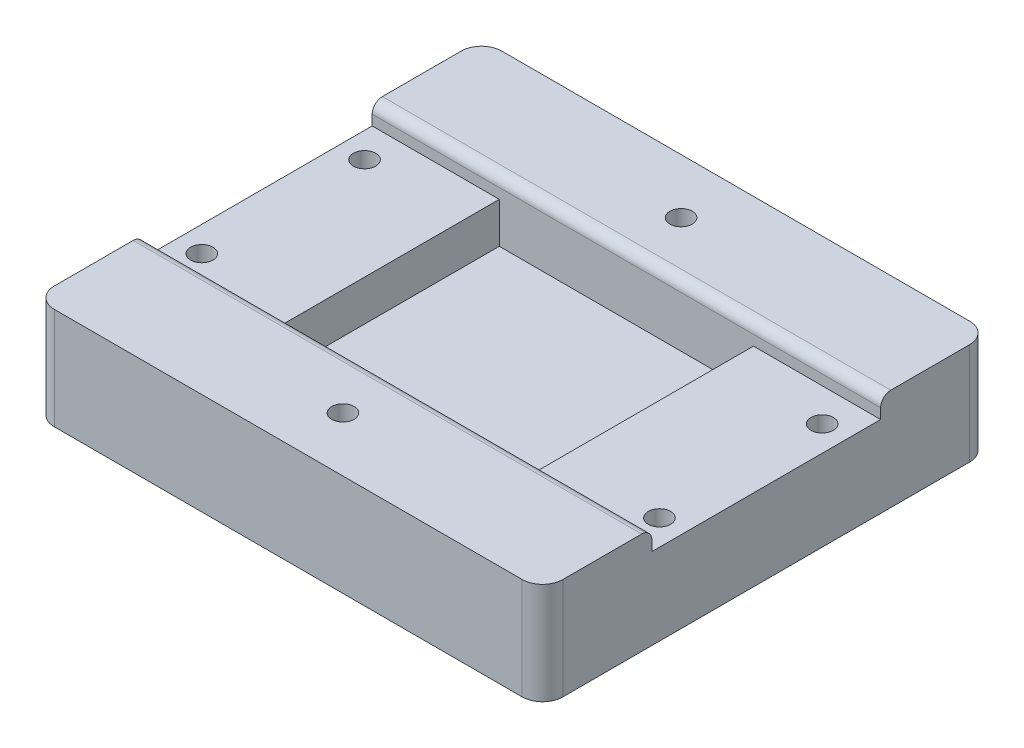
ISO-10303-21;
HEADER;
FILE_DESCRIPTION(('STEP AP214'),'2;1');
FILE_NAME('part.step','',(''),(''),'','','');
FILE_SCHEMA(('AUTOMOTIVE_DESIGN { 1 0 10303 214 1 1 1 1 }'));
ENDSEC;
DATA;
#1=APPLICATION_CONTEXT('core data for automotive mechanical design processes');
#2=APPLICATION_PROTOCOL_DEFINITION('international standard','automotive_design',2000,#1);
#3=PRODUCT_CONTEXT('',#1,'mechanical');
#4=PRODUCT('Part','Part','',(#3));
#5=PRODUCT_RELATED_PRODUCT_CATEGORY('part','',(#4));
#6=PRODUCT_DEFINITION_FORMATION('','',#4);
#7=PRODUCT_DEFINITION_CONTEXT('part definition',#1,'design');
#8=PRODUCT_DEFINITION('design','',#6,#7);
#9=PRODUCT_DEFINITION_SHAPE('','',#8);
#10=(LENGTH_UNIT() NAMED_UNIT(*) SI_UNIT(.MILLI.,.METRE.));
#11=(NAMED_UNIT(*) PLANE_ANGLE_UNIT() SI_UNIT($,.RADIAN.));
#12=(NAMED_UNIT(*) SI_UNIT($,.STERADIAN.) SOLID_ANGLE_UNIT());
#13=UNCERTAINTY_MEASURE_WITH_UNIT(LENGTH_MEASURE(1.E-05),#10,'distance_accuracy_value','');
#14=(GEOMETRIC_REPRESENTATION_CONTEXT(3) GLOBAL_UNCERTAINTY_ASSIGNED_CONTEXT((#13)) GLOBAL_UNIT_ASSIGNED_CONTEXT((#10,
#11,#12)) REPRESENTATION_CONTEXT('',''));
#15=CARTESIAN_POINT('',(0.,0.,0.));
#16=DIRECTION('',(0.,0.,1.));
#17=DIRECTION('',(1.,0.,0.));
#18=AXIS2_PLACEMENT_3D('',#15,#16,#17);
#19=CARTESIAN_POINT('',(0.,8.,0.));
#20=DIRECTION('',(0.,1.,0.));
#21=DIRECTION('',(0.,0.,1.));
#22=AXIS2_PLACEMENT_3D('',#19,#20,#21);
#23=PLANE('',#22);
#24=CARTESIAN_POINT('',(-22.5,8.,-8.));
#25=DIRECTION('',(0.,1.,0.));
#26=DIRECTION('',(0.,0.,1.));
#27=AXIS2_PLACEMENT_3D('',#24,#25,#26);
#28=CIRCLE('',#27,1.1);
#29=CARTESIAN_POINT('',(-22.5,8.,-6.9));
#30=VERTEX_POINT('',#29);
#31=EDGE_CURVE('E477',#30,#30,#28,.T.);
#32=ORIENTED_EDGE('',*,*,#31,.F.);
#33=EDGE_LOOP('',(#32));
#34=FACE_BOUND('',#33,.T.);
#35=CARTESIAN_POINT('',(-22.5,8.,8.));
#36=DIRECTION('',(0.,1.,0.));
#37=DIRECTION('',(0.,0.,1.));
#38=AXIS2_PLACEMENT_3D('',#35,#36,#37);
#39=CIRCLE('',#38,1.1);
#40=CARTESIAN_POINT('',(-22.5,8.,9.1));
#41=VERTEX_POINT('',#40);
#42=EDGE_CURVE('E193',#41,#41,#39,.T.);
#43=ORIENTED_EDGE('',*,*,#42,.F.);
#44=EDGE_LOOP('',(#43));
#45=FACE_BOUND('',#44,.T.);
#46=DIRECTION('',(0.,0.,1.));
#47=VECTOR('',#46,1.);
#48=CARTESIAN_POINT('',(-12.5,8.,11.25));
#49=LINE('',#48,#47);
#50=CARTESIAN_POINT('',(-12.5,8.,-11.25));
#51=VERTEX_POINT('',#50);
#52=CARTESIAN_POINT('',(-12.5,8.,11.25));
#53=VERTEX_POINT('',#52);
#54=EDGE_CURVE('E169',#51,#53,#49,.T.);
#55=ORIENTED_EDGE('',*,*,#54,.F.);
#56=DIRECTION('',(-1.,0.,0.));
#57=VECTOR('',#56,1.);
#58=CARTESIAN_POINT('',(29.,8.,-11.25));
#59=LINE('',#58,#57);
#60=CARTESIAN_POINT('',(-25.,8.,-11.25));
#61=VERTEX_POINT('',#60);
#62=EDGE_CURVE('E208',#51,#61,#59,.T.);
#63=ORIENTED_EDGE('',*,*,#62,.T.);
#64=DIRECTION('',(0.,0.,1.));
#65=VECTOR('',#64,1.);
#66=CARTESIAN_POINT('',(-25.,8.,22.));
#67=LINE('',#66,#65);
#68=CARTESIAN_POINT('',(-25.,8.,11.25));
#69=VERTEX_POINT('',#68);
#70=EDGE_CURVE('E221',#61,#69,#67,.T.);
#71=ORIENTED_EDGE('',*,*,#70,.T.);
#72=DIRECTION('',(1.,0.,0.));
#73=VECTOR('',#72,1.);
#74=CARTESIAN_POINT('',(29.,8.,11.25));
#75=LINE('',#74,#73);
#76=EDGE_CURVE('E206',#69,#53,#75,.T.);
#77=ORIENTED_EDGE('',*,*,#76,.T.);
#78=EDGE_LOOP('',(#55,#63,#71,#77));
#79=FACE_BOUND('',#78,.T.);
#80=ADVANCED_FACE('F37',(#34,#45,#79),#23,.T.);
#81=CARTESIAN_POINT('',(0.,10.,0.));
#82=DIRECTION('',(0.,1.,0.));
#83=DIRECTION('',(0.,0.,1.));
#84=AXIS2_PLACEMENT_3D('',#81,#82,#83);
#85=PLANE('',#84);
#86=CARTESIAN_POINT('',(0.,10.,-16.625));
#87=DIRECTION('',(0.,1.,0.));
#88=DIRECTION('',(0.,0.,1.));
#89=AXIS2_PLACEMENT_3D('',#86,#87,#88);
#90=CIRCLE('',#89,1.1);
#91=CARTESIAN_POINT('',(0.,10.,-15.525));
#92=VERTEX_POINT('',#91);
#93=EDGE_CURVE('E467',#92,#92,#90,.T.);
#94=ORIENTED_EDGE('',*,*,#93,.F.);
#95=EDGE_LOOP('',(#94));
#96=FACE_BOUND('',#95,.T.);
#97=DIRECTION('',(0.,0.,1.));
#98=VECTOR('',#97,1.);
#99=CARTESIAN_POINT('',(-25.,10.,22.));
#100=LINE('',#99,#98);
#101=CARTESIAN_POINT('',(-25.,10.,-20.));
#102=VERTEX_POINT('',#101);
#103=CARTESIAN_POINT('',(-25.,10.,-12.25));
#104=VERTEX_POINT('',#103);
#105=EDGE_CURVE('E225',#102,#104,#100,.T.);
#106=ORIENTED_EDGE('',*,*,#105,.T.);
#107=DIRECTION('',(-1.,0.,0.));
#108=VECTOR('',#107,1.);
#109=CARTESIAN_POINT('',(25.,10.,-12.25));
#110=LINE('',#109,#108);
#111=CARTESIAN_POINT('',(25.,10.,-12.25));
#112=VERTEX_POINT('',#111);
#113=EDGE_CURVE('E11',#104,#112,#110,.F.);
#114=ORIENTED_EDGE('',*,*,#113,.T.);
#115=DIRECTION('',(0.,0.,-1.));
#116=VECTOR('',#115,1.);
#117=CARTESIAN_POINT('',(25.,10.,22.));
#118=LINE('',#117,#116);
#119=CARTESIAN_POINT('',(25.,10.,-20.));
#120=VERTEX_POINT('',#119);
#121=EDGE_CURVE('E231',#112,#120,#118,.T.);
#122=ORIENTED_EDGE('',*,*,#121,.T.);
#123=CARTESIAN_POINT('',(23.,10.,-20.));
#124=DIRECTION('',(0.,1.,0.));
#125=DIRECTION('',(0.,0.,1.));
#126=AXIS2_PLACEMENT_3D('',#123,#124,#125);
#127=CIRCLE('',#126,2.);
#128=CARTESIAN_POINT('',(23.,10.,-22.));
#129=VERTEX_POINT('',#128);
#130=EDGE_CURVE('E271',#120,#129,#127,.T.);
#131=ORIENTED_EDGE('',*,*,#130,.T.);
#132=DIRECTION('',(-1.,0.,0.));
#133=VECTOR('',#132,1.);
#134=CARTESIAN_POINT('',(25.,10.,-22.));
#135=LINE('',#134,#133);
#136=CARTESIAN_POINT('',(-23.,10.,-22.));
#137=VERTEX_POINT('',#136);
#138=EDGE_CURVE('E235',#129,#137,#135,.T.);
#139=ORIENTED_EDGE('',*,*,#138,.T.);
#140=CARTESIAN_POINT('',(-23.,10.,-20.));
#141=DIRECTION('',(0.,1.,0.));
#142=DIRECTION('',(0.,0.,1.));
#143=AXIS2_PLACEMENT_3D('',#140,#141,#142);
#144=CIRCLE('',#143,2.);
#145=EDGE_CURVE('E273',#137,#102,#144,.T.);
#146=ORIENTED_EDGE('',*,*,#145,.T.);
#147=EDGE_LOOP('',(#106,#114,#122,#131,#139,#146));
#148=FACE_BOUND('',#147,.T.);
#149=ADVANCED_FACE('F347',(#96,#148),#85,.T.);
#150=CARTESIAN_POINT('',(-25.,10.,22.));
#151=DIRECTION('',(1.,0.,0.));
#152=DIRECTION('',(0.,0.,-1.));
#153=AXIS2_PLACEMENT_3D('',#150,#151,#152);
#154=PLANE('',#153);
#155=CARTESIAN_POINT('',(-25.,10.,12.25));
#156=VERTEX_POINT('',#155);
#157=CARTESIAN_POINT('',(-25.,10.,20.));
#158=VERTEX_POINT('',#157);
#159=EDGE_CURVE('E228',#156,#158,#100,.T.);
#160=ORIENTED_EDGE('',*,*,#159,.F.);
#161=CARTESIAN_POINT('',(-25.,9.,12.25));
#162=DIRECTION('',(1.,0.,0.));
#163=DIRECTION('',(0.,0.,-1.));
#164=AXIS2_PLACEMENT_3D('',#161,#162,#163);
#165=CIRCLE('',#164,1.);
#166=CARTESIAN_POINT('',(-25.,9.,11.25));
#167=VERTEX_POINT('',#166);
#168=EDGE_CURVE('E300',#156,#167,#165,.F.);
#169=ORIENTED_EDGE('',*,*,#168,.T.);
#170=DIRECTION('',(0.,-1.,0.));
#171=VECTOR('',#170,1.);
#172=CARTESIAN_POINT('',(-25.,10.,11.25));
#173=LINE('',#172,#171);
#174=EDGE_CURVE('E215',#167,#69,#173,.T.);
#175=ORIENTED_EDGE('',*,*,#174,.T.);
#176=ORIENTED_EDGE('',*,*,#70,.F.);
#177=DIRECTION('',(0.,1.,0.));
#178=VECTOR('',#177,1.);
#179=CARTESIAN_POINT('',(-25.,10.,-11.25));
#180=LINE('',#179,#178);
#181=CARTESIAN_POINT('',(-25.,9.,-11.25));
#182=VERTEX_POINT('',#181);
#183=EDGE_CURVE('E219',#61,#182,#180,.T.);
#184=ORIENTED_EDGE('',*,*,#183,.T.);
#185=CARTESIAN_POINT('',(-25.,9.,-12.25));
#186=DIRECTION('',(1.,0.,0.));
#187=DIRECTION('',(0.,0.,-1.));
#188=AXIS2_PLACEMENT_3D('',#185,#186,#187);
#189=CIRCLE('',#188,1.);
#190=EDGE_CURVE('E52',#182,#104,#189,.F.);
#191=ORIENTED_EDGE('',*,*,#190,.T.);
#192=ORIENTED_EDGE('',*,*,#105,.F.);
#193=DIRECTION('',(0.,-1.,0.));
#194=VECTOR('',#193,1.);
#195=CARTESIAN_POINT('',(-25.,10.,-20.));
#196=LINE('',#195,#194);
#197=CARTESIAN_POINT('',(-25.,0.,-20.));
#198=VERTEX_POINT('',#197);
#199=EDGE_CURVE('E255',#102,#198,#196,.T.);
#200=ORIENTED_EDGE('',*,*,#199,.T.);
#201=DIRECTION('',(0.,0.,1.));
#202=VECTOR('',#201,1.);
#203=CARTESIAN_POINT('',(-25.,0.,22.));
#204=LINE('',#203,#202);
#205=CARTESIAN_POINT('',(-25.,0.,20.));
#206=VERTEX_POINT('',#205);
#207=EDGE_CURVE('E224',#198,#206,#204,.T.);
#208=ORIENTED_EDGE('',*,*,#207,.T.);
#209=DIRECTION('',(0.,-1.,0.));
#210=VECTOR('',#209,1.);
#211=CARTESIAN_POINT('',(-25.,10.,20.));
#212=LINE('',#211,#210);
#213=EDGE_CURVE('E252',#206,#158,#212,.F.);
#214=ORIENTED_EDGE('',*,*,#213,.T.);
#215=EDGE_LOOP('',(#160,#169,#175,#176,#184,#191,#192,#200,#208,#214));
#216=FACE_BOUND('',#215,.T.);
#217=ADVANCED_FACE('F310',(#216),#154,.F.);
#218=CARTESIAN_POINT('',(25.,10.,22.));
#219=DIRECTION('',(0.,0.,-1.));
#220=DIRECTION('',(-1.,0.,0.));
#221=AXIS2_PLACEMENT_3D('',#218,#219,#220);
#222=PLANE('',#221);
#223=DIRECTION('',(1.,0.,0.));
#224=VECTOR('',#223,1.);
#225=CARTESIAN_POINT('',(25.,10.,22.));
#226=LINE('',#225,#224);
#227=CARTESIAN_POINT('',(-23.,10.,22.));
#228=VERTEX_POINT('',#227);
#229=CARTESIAN_POINT('',(23.,10.,22.));
#230=VERTEX_POINT('',#229);
#231=EDGE_CURVE('E227',#228,#230,#226,.T.);
#232=ORIENTED_EDGE('',*,*,#231,.F.);
#233=DIRECTION('',(0.,-1.,0.));
#234=VECTOR('',#233,1.);
#235=CARTESIAN_POINT('',(-23.,10.,22.));
#236=LINE('',#235,#234);
#237=CARTESIAN_POINT('',(-23.,0.,22.));
#238=VERTEX_POINT('',#237);
#239=EDGE_CURVE('E277',#228,#238,#236,.T.);
#240=ORIENTED_EDGE('',*,*,#239,.T.);
#241=DIRECTION('',(1.,0.,0.));
#242=VECTOR('',#241,1.);
#243=CARTESIAN_POINT('',(25.,0.,22.));
#244=LINE('',#243,#242);
#245=CARTESIAN_POINT('',(23.,0.,22.));
#246=VERTEX_POINT('',#245);
#247=EDGE_CURVE('E241',#238,#246,#244,.T.);
#248=ORIENTED_EDGE('',*,*,#247,.T.);
#249=DIRECTION('',(0.,-1.,0.));
#250=VECTOR('',#249,1.);
#251=CARTESIAN_POINT('',(23.,10.,22.));
#252=LINE('',#251,#250);
#253=EDGE_CURVE('E275',#246,#230,#252,.F.);
#254=ORIENTED_EDGE('',*,*,#253,.T.);
#255=EDGE_LOOP('',(#232,#240,#248,#254));
#256=FACE_BOUND('',#255,.T.);
#257=ADVANCED_FACE('F357',(#256),#222,.F.);
#258=CARTESIAN_POINT('',(25.,10.,22.));
#259=DIRECTION('',(-1.,0.,0.));
#260=DIRECTION('',(0.,0.,1.));
#261=AXIS2_PLACEMENT_3D('',#258,#259,#260);
#262=PLANE('',#261);
#263=DIRECTION('',(0.,1.,0.));
#264=VECTOR('',#263,1.);
#265=CARTESIAN_POINT('',(25.,10.,11.25));
#266=LINE('',#265,#264);
#267=CARTESIAN_POINT('',(25.,8.,11.25));
#268=VERTEX_POINT('',#267);
#269=CARTESIAN_POINT('',(25.,9.,11.25));
#270=VERTEX_POINT('',#269);
#271=EDGE_CURVE('E212',#268,#270,#266,.T.);
#272=ORIENTED_EDGE('',*,*,#271,.T.);
#273=CARTESIAN_POINT('',(25.,9.,12.25));
#274=DIRECTION('',(-1.,0.,0.));
#275=DIRECTION('',(0.,0.,1.));
#276=AXIS2_PLACEMENT_3D('',#273,#274,#275);
#277=CIRCLE('',#276,1.);
#278=CARTESIAN_POINT('',(25.,10.,12.25));
#279=VERTEX_POINT('',#278);
#280=EDGE_CURVE('E295',#270,#279,#277,.F.);
#281=ORIENTED_EDGE('',*,*,#280,.T.);
#282=CARTESIAN_POINT('',(25.,10.,20.));
#283=VERTEX_POINT('',#282);
#284=EDGE_CURVE('E232',#283,#279,#118,.T.);
#285=ORIENTED_EDGE('',*,*,#284,.F.);
#286=DIRECTION('',(0.,-1.,0.));
#287=VECTOR('',#286,1.);
#288=CARTESIAN_POINT('',(25.,10.,20.));
#289=LINE('',#288,#287);
#290=CARTESIAN_POINT('',(25.,0.,20.));
#291=VERTEX_POINT('',#290);
#292=EDGE_CURVE('E287',#283,#291,#289,.T.);
#293=ORIENTED_EDGE('',*,*,#292,.T.);
#294=DIRECTION('',(0.,0.,-1.));
#295=VECTOR('',#294,1.);
#296=CARTESIAN_POINT('',(25.,0.,22.));
#297=LINE('',#296,#295);
#298=CARTESIAN_POINT('',(25.,0.,-20.));
#299=VERTEX_POINT('',#298);
#300=EDGE_CURVE('E244',#291,#299,#297,.T.);
#301=ORIENTED_EDGE('',*,*,#300,.T.);
#302=DIRECTION('',(0.,-1.,0.));
#303=VECTOR('',#302,1.);
#304=CARTESIAN_POINT('',(25.,10.,-20.));
#305=LINE('',#304,#303);
#306=EDGE_CURVE('E284',#299,#120,#305,.F.);
#307=ORIENTED_EDGE('',*,*,#306,.T.);
#308=ORIENTED_EDGE('',*,*,#121,.F.);
#309=CARTESIAN_POINT('',(25.,9.,-12.25));
#310=DIRECTION('',(-1.,0.,0.));
#311=DIRECTION('',(0.,0.,1.));
#312=AXIS2_PLACEMENT_3D('',#309,#310,#311);
#313=CIRCLE('',#312,1.);
#314=CARTESIAN_POINT('',(25.,9.,-11.25));
#315=VERTEX_POINT('',#314);
#316=EDGE_CURVE('E293',#112,#315,#313,.F.);
#317=ORIENTED_EDGE('',*,*,#316,.T.);
#318=DIRECTION('',(0.,-1.,0.));
#319=VECTOR('',#318,1.);
#320=CARTESIAN_POINT('',(25.,10.,-11.25));
#321=LINE('',#320,#319);
#322=CARTESIAN_POINT('',(25.,8.,-11.25));
#323=VERTEX_POINT('',#322);
#324=EDGE_CURVE('E217',#315,#323,#321,.T.);
#325=ORIENTED_EDGE('',*,*,#324,.T.);
#326=DIRECTION('',(0.,0.,-1.));
#327=VECTOR('',#326,1.);
#328=CARTESIAN_POINT('',(25.,8.,22.));
#329=LINE('',#328,#327);
#330=EDGE_CURVE('E238',#268,#323,#329,.T.);
#331=ORIENTED_EDGE('',*,*,#330,.F.);
#332=EDGE_LOOP('',(#272,#281,#285,#293,#301,#307,#308,#317,#325,#331));
#333=FACE_BOUND('',#332,.T.);
#334=ADVANCED_FACE('F320',(#333),#262,.F.);
#335=CARTESIAN_POINT('',(25.,10.,-22.));
#336=DIRECTION('',(0.,0.,1.));
#337=DIRECTION('',(1.,0.,0.));
#338=AXIS2_PLACEMENT_3D('',#335,#336,#337);
#339=PLANE('',#338);
#340=DIRECTION('',(-1.,0.,0.));
#341=VECTOR('',#340,1.);
#342=CARTESIAN_POINT('',(25.,0.,-22.));
#343=LINE('',#342,#341);
#344=CARTESIAN_POINT('',(23.,0.,-22.));
#345=VERTEX_POINT('',#344);
#346=CARTESIAN_POINT('',(-23.,0.,-22.));
#347=VERTEX_POINT('',#346);
#348=EDGE_CURVE('E247',#345,#347,#343,.T.);
#349=ORIENTED_EDGE('',*,*,#348,.T.);
#350=DIRECTION('',(0.,-1.,0.));
#351=VECTOR('',#350,1.);
#352=CARTESIAN_POINT('',(-23.,10.,-22.));
#353=LINE('',#352,#351);
#354=EDGE_CURVE('E269',#347,#137,#353,.F.);
#355=ORIENTED_EDGE('',*,*,#354,.T.);
#356=ORIENTED_EDGE('',*,*,#138,.F.);
#357=DIRECTION('',(0.,-1.,0.));
#358=VECTOR('',#357,1.);
#359=CARTESIAN_POINT('',(23.,10.,-22.));
#360=LINE('',#359,#358);
#361=EDGE_CURVE('E266',#129,#345,#360,.T.);
#362=ORIENTED_EDGE('',*,*,#361,.T.);
#363=EDGE_LOOP('',(#349,#355,#356,#362));
#364=FACE_BOUND('',#363,.T.);
#365=ADVANCED_FACE('F343',(#364),#339,.F.);
#366=CARTESIAN_POINT('',(0.,10.,16.625));
#367=DIRECTION('',(0.,1.,0.));
#368=DIRECTION('',(0.,0.,1.));
#369=AXIS2_PLACEMENT_3D('',#366,#367,#368);
#370=CIRCLE('',#369,1.1);
#371=CARTESIAN_POINT('',(0.,10.,17.725));
#372=VERTEX_POINT('',#371);
#373=EDGE_CURVE('E457',#372,#372,#370,.T.);
#374=ORIENTED_EDGE('',*,*,#373,.F.);
#375=EDGE_LOOP('',(#374));
#376=FACE_BOUND('',#375,.T.);
#377=ORIENTED_EDGE('',*,*,#284,.T.);
#378=DIRECTION('',(1.,0.,0.));
#379=VECTOR('',#378,1.);
#380=CARTESIAN_POINT('',(-25.,10.,12.25));
#381=LINE('',#380,#379);
#382=EDGE_CURVE('E297',#279,#156,#381,.F.);
#383=ORIENTED_EDGE('',*,*,#382,.T.);
#384=ORIENTED_EDGE('',*,*,#159,.T.);
#385=CARTESIAN_POINT('',(-23.,10.,20.));
#386=DIRECTION('',(0.,1.,0.));
#387=DIRECTION('',(0.,0.,1.));
#388=AXIS2_PLACEMENT_3D('',#385,#386,#387);
#389=CIRCLE('',#388,2.);
#390=EDGE_CURVE('E282',#158,#228,#389,.T.);
#391=ORIENTED_EDGE('',*,*,#390,.T.);
#392=ORIENTED_EDGE('',*,*,#231,.T.);
#393=CARTESIAN_POINT('',(23.,10.,20.));
#394=DIRECTION('',(0.,1.,0.));
#395=DIRECTION('',(0.,0.,1.));
#396=AXIS2_PLACEMENT_3D('',#393,#394,#395);
#397=CIRCLE('',#396,2.);
#398=EDGE_CURVE('E280',#230,#283,#397,.T.);
#399=ORIENTED_EDGE('',*,*,#398,.T.);
#400=EDGE_LOOP('',(#377,#383,#384,#391,#392,#399));
#401=FACE_BOUND('',#400,.T.);
#402=ADVANCED_FACE('F324',(#376,#401),#85,.T.);
#403=CARTESIAN_POINT('',(0.,0.,0.));
#404=DIRECTION('',(0.,1.,0.));
#405=DIRECTION('',(0.,0.,1.));
#406=AXIS2_PLACEMENT_3D('',#403,#404,#405);
#407=PLANE('',#406);
#408=ORIENTED_EDGE('',*,*,#207,.F.);
#409=CARTESIAN_POINT('',(-23.,0.,-20.));
#410=DIRECTION('',(0.,1.,0.));
#411=DIRECTION('',(0.,0.,1.));
#412=AXIS2_PLACEMENT_3D('',#409,#410,#411);
#413=CIRCLE('',#412,2.);
#414=EDGE_CURVE('E264',#198,#347,#413,.F.);
#415=ORIENTED_EDGE('',*,*,#414,.T.);
#416=ORIENTED_EDGE('',*,*,#348,.F.);
#417=CARTESIAN_POINT('',(23.,0.,-20.));
#418=DIRECTION('',(0.,1.,0.));
#419=DIRECTION('',(0.,0.,1.));
#420=AXIS2_PLACEMENT_3D('',#417,#418,#419);
#421=CIRCLE('',#420,2.);
#422=EDGE_CURVE('E258',#345,#299,#421,.F.);
#423=ORIENTED_EDGE('',*,*,#422,.T.);
#424=ORIENTED_EDGE('',*,*,#300,.F.);
#425=CARTESIAN_POINT('',(23.,0.,20.));
#426=DIRECTION('',(0.,1.,0.));
#427=DIRECTION('',(0.,0.,1.));
#428=AXIS2_PLACEMENT_3D('',#425,#426,#427);
#429=CIRCLE('',#428,2.);
#430=EDGE_CURVE('E260',#291,#246,#429,.F.);
#431=ORIENTED_EDGE('',*,*,#430,.T.);
#432=ORIENTED_EDGE('',*,*,#247,.F.);
#433=CARTESIAN_POINT('',(-23.,0.,20.));
#434=DIRECTION('',(0.,1.,0.));
#435=DIRECTION('',(0.,0.,1.));
#436=AXIS2_PLACEMENT_3D('',#433,#434,#435);
#437=CIRCLE('',#436,2.);
#438=EDGE_CURVE('E262',#238,#206,#437,.F.);
#439=ORIENTED_EDGE('',*,*,#438,.T.);
#440=EDGE_LOOP('',(#408,#415,#416,#423,#424,#431,#432,#439));
#441=FACE_BOUND('',#440,.T.);
#442=ADVANCED_FACE('F334',(#441),#407,.F.);
#443=CARTESIAN_POINT('',(22.5,8.,8.));
#444=DIRECTION('',(0.,1.,0.));
#445=DIRECTION('',(0.,0.,1.));
#446=AXIS2_PLACEMENT_3D('',#443,#444,#445);
#447=CIRCLE('',#446,1.1);
#448=CARTESIAN_POINT('',(22.5,8.,9.1));
#449=VERTEX_POINT('',#448);
#450=EDGE_CURVE('E389',#449,#449,#447,.T.);
#451=ORIENTED_EDGE('',*,*,#450,.F.);
#452=EDGE_LOOP('',(#451));
#453=FACE_BOUND('',#452,.T.);
#454=CARTESIAN_POINT('',(22.5,8.,-8.));
#455=DIRECTION('',(0.,1.,0.));
#456=DIRECTION('',(0.,0.,1.));
#457=AXIS2_PLACEMENT_3D('',#454,#455,#456);
#458=CIRCLE('',#457,1.1);
#459=CARTESIAN_POINT('',(22.5,8.,-6.9));
#460=VERTEX_POINT('',#459);
#461=EDGE_CURVE('E393',#460,#460,#458,.T.);
#462=ORIENTED_EDGE('',*,*,#461,.F.);
#463=EDGE_LOOP('',(#462));
#464=FACE_BOUND('',#463,.T.);
#465=DIRECTION('',(0.,0.,-1.));
#466=VECTOR('',#465,1.);
#467=CARTESIAN_POINT('',(12.5,8.,11.25));
#468=LINE('',#467,#466);
#469=CARTESIAN_POINT('',(12.5,8.,11.25));
#470=VERTEX_POINT('',#469);
#471=CARTESIAN_POINT('',(12.5,8.,-11.25));
#472=VERTEX_POINT('',#471);
#473=EDGE_CURVE('E188',#470,#472,#468,.T.);
#474=ORIENTED_EDGE('',*,*,#473,.F.);
#475=EDGE_CURVE('E202',#470,#268,#75,.T.);
#476=ORIENTED_EDGE('',*,*,#475,.T.);
#477=ORIENTED_EDGE('',*,*,#330,.T.);
#478=EDGE_CURVE('E209',#323,#472,#59,.T.);
#479=ORIENTED_EDGE('',*,*,#478,.T.);
#480=EDGE_LOOP('',(#474,#476,#477,#479));
#481=FACE_BOUND('',#480,.T.);
#482=ADVANCED_FACE('F369',(#453,#464,#481),#23,.T.);
#483=CARTESIAN_POINT('',(29.,8.,-11.25));
#484=DIRECTION('',(0.,0.,-1.));
#485=DIRECTION('',(-1.,0.,0.));
#486=AXIS2_PLACEMENT_3D('',#483,#484,#485);
#487=PLANE('',#486);
#488=ORIENTED_EDGE('',*,*,#324,.F.);
#489=DIRECTION('',(-1.,0.,0.));
#490=VECTOR('',#489,1.);
#491=CARTESIAN_POINT('',(-25.,9.,-11.25));
#492=LINE('',#491,#490);
#493=EDGE_CURVE('E45',#315,#182,#492,.T.);
#494=ORIENTED_EDGE('',*,*,#493,.T.);
#495=ORIENTED_EDGE('',*,*,#183,.F.);
#496=ORIENTED_EDGE('',*,*,#62,.F.);
#497=DIRECTION('',(0.,1.,0.));
#498=VECTOR('',#497,1.);
#499=CARTESIAN_POINT('',(-12.5,4.,-11.25));
#500=LINE('',#499,#498);
#501=CARTESIAN_POINT('',(-12.5,4.,-11.25));
#502=VERTEX_POINT('',#501);
#503=EDGE_CURVE('E200',#502,#51,#500,.T.);
#504=ORIENTED_EDGE('',*,*,#503,.F.);
#505=DIRECTION('',(-1.,0.,0.));
#506=VECTOR('',#505,1.);
#507=CARTESIAN_POINT('',(12.5,4.,-11.25));
#508=LINE('',#507,#506);
#509=CARTESIAN_POINT('',(12.5,4.,-11.25));
#510=VERTEX_POINT('',#509);
#511=EDGE_CURVE('E174',#510,#502,#508,.T.);
#512=ORIENTED_EDGE('',*,*,#511,.F.);
#513=DIRECTION('',(0.,1.,0.));
#514=VECTOR('',#513,1.);
#515=CARTESIAN_POINT('',(12.5,4.,-11.25));
#516=LINE('',#515,#514);
#517=EDGE_CURVE('E203',#510,#472,#516,.T.);
#518=ORIENTED_EDGE('',*,*,#517,.T.);
#519=ORIENTED_EDGE('',*,*,#478,.F.);
#520=EDGE_LOOP('',(#488,#494,#495,#496,#504,#512,#518,#519));
#521=FACE_BOUND('',#520,.T.);
#522=ADVANCED_FACE('F304',(#521),#487,.F.);
#523=CARTESIAN_POINT('',(29.,8.,11.25));
#524=DIRECTION('',(0.,0.,1.));
#525=DIRECTION('',(1.,0.,0.));
#526=AXIS2_PLACEMENT_3D('',#523,#524,#525);
#527=PLANE('',#526);
#528=ORIENTED_EDGE('',*,*,#174,.F.);
#529=DIRECTION('',(1.,0.,0.));
#530=VECTOR('',#529,1.);
#531=CARTESIAN_POINT('',(25.,9.,11.25));
#532=LINE('',#531,#530);
#533=EDGE_CURVE('E290',#167,#270,#532,.T.);
#534=ORIENTED_EDGE('',*,*,#533,.T.);
#535=ORIENTED_EDGE('',*,*,#271,.F.);
#536=ORIENTED_EDGE('',*,*,#475,.F.);
#537=DIRECTION('',(0.,1.,0.));
#538=VECTOR('',#537,1.);
#539=CARTESIAN_POINT('',(12.5,4.,11.25));
#540=LINE('',#539,#538);
#541=CARTESIAN_POINT('',(12.5,4.,11.25));
#542=VERTEX_POINT('',#541);
#543=EDGE_CURVE('E173',#542,#470,#540,.T.);
#544=ORIENTED_EDGE('',*,*,#543,.F.);
#545=DIRECTION('',(1.,0.,0.));
#546=VECTOR('',#545,1.);
#547=CARTESIAN_POINT('',(12.5,4.,11.25));
#548=LINE('',#547,#546);
#549=CARTESIAN_POINT('',(-12.5,4.,11.25));
#550=VERTEX_POINT('',#549);
#551=EDGE_CURVE('E177',#550,#542,#548,.T.);
#552=ORIENTED_EDGE('',*,*,#551,.F.);
#553=DIRECTION('',(0.,1.,0.));
#554=VECTOR('',#553,1.);
#555=CARTESIAN_POINT('',(-12.5,4.,11.25));
#556=LINE('',#555,#554);
#557=EDGE_CURVE('E162',#550,#53,#556,.T.);
#558=ORIENTED_EDGE('',*,*,#557,.T.);
#559=ORIENTED_EDGE('',*,*,#76,.F.);
#560=EDGE_LOOP('',(#528,#534,#535,#536,#544,#552,#558,#559));
#561=FACE_BOUND('',#560,.T.);
#562=ADVANCED_FACE('F179',(#561),#527,.F.);
#563=CARTESIAN_POINT('',(-12.5,4.,11.25));
#564=DIRECTION('',(-1.,0.,0.));
#565=DIRECTION('',(0.,0.,1.));
#566=AXIS2_PLACEMENT_3D('',#563,#564,#565);
#567=PLANE('',#566);
#568=ORIENTED_EDGE('',*,*,#54,.T.);
#569=ORIENTED_EDGE('',*,*,#557,.F.);
#570=DIRECTION('',(0.,0.,1.));
#571=VECTOR('',#570,1.);
#572=CARTESIAN_POINT('',(-12.5,4.,11.25));
#573=LINE('',#572,#571);
#574=EDGE_CURVE('E166',#502,#550,#573,.T.);
#575=ORIENTED_EDGE('',*,*,#574,.F.);
#576=ORIENTED_EDGE('',*,*,#503,.T.);
#577=EDGE_LOOP('',(#568,#569,#575,#576));
#578=FACE_BOUND('',#577,.T.);
#579=ADVANCED_FACE('F164',(#578),#567,.F.);
#580=CARTESIAN_POINT('',(12.5,4.,11.25));
#581=DIRECTION('',(1.,0.,0.));
#582=DIRECTION('',(0.,0.,-1.));
#583=AXIS2_PLACEMENT_3D('',#580,#581,#582);
#584=PLANE('',#583);
#585=ORIENTED_EDGE('',*,*,#473,.T.);
#586=ORIENTED_EDGE('',*,*,#517,.F.);
#587=DIRECTION('',(0.,0.,-1.));
#588=VECTOR('',#587,1.);
#589=CARTESIAN_POINT('',(12.5,4.,11.25));
#590=LINE('',#589,#588);
#591=EDGE_CURVE('E184',#542,#510,#590,.T.);
#592=ORIENTED_EDGE('',*,*,#591,.F.);
#593=ORIENTED_EDGE('',*,*,#543,.T.);
#594=EDGE_LOOP('',(#585,#586,#592,#593));
#595=FACE_BOUND('',#594,.T.);
#596=ADVANCED_FACE('F396',(#595),#584,.F.);
#597=CARTESIAN_POINT('',(0.,4.,0.));
#598=DIRECTION('',(0.,1.,0.));
#599=DIRECTION('',(0.,0.,1.));
#600=AXIS2_PLACEMENT_3D('',#597,#598,#599);
#601=PLANE('',#600);
#602=ORIENTED_EDGE('',*,*,#574,.T.);
#603=ORIENTED_EDGE('',*,*,#551,.T.);
#604=ORIENTED_EDGE('',*,*,#591,.T.);
#605=ORIENTED_EDGE('',*,*,#511,.T.);
#606=EDGE_LOOP('',(#602,#603,#604,#605));
#607=FACE_BOUND('',#606,.T.);
#608=ADVANCED_FACE('F186',(#607),#601,.T.);
#609=CARTESIAN_POINT('',(22.5,3.,-8.));
#610=DIRECTION('',(0.,1.,0.));
#611=DIRECTION('',(0.,0.,1.));
#612=AXIS2_PLACEMENT_3D('',#609,#610,#611);
#613=CYLINDRICAL_SURFACE('',#612,1.1);
#614=CARTESIAN_POINT('',(22.5,3.,-8.));
#615=DIRECTION('',(0.,1.,0.));
#616=DIRECTION('',(0.,0.,1.));
#617=AXIS2_PLACEMENT_3D('',#614,#615,#616);
#618=CIRCLE('',#617,1.1);
#619=CARTESIAN_POINT('',(22.5,3.,-6.9));
#620=VERTEX_POINT('',#619);
#621=EDGE_CURVE('E470',#620,#620,#618,.T.);
#622=ORIENTED_EDGE('',*,*,#621,.F.);
#623=EDGE_LOOP('',(#622));
#624=FACE_BOUND('',#623,.T.);
#625=ORIENTED_EDGE('',*,*,#461,.T.);
#626=EDGE_LOOP('',(#625));
#627=FACE_BOUND('',#626,.T.);
#628=ADVANCED_FACE('F403',(#624,#627),#613,.F.);
#629=CARTESIAN_POINT('',(22.5,3.,-8.));
#630=DIRECTION('',(0.,1.,0.));
#631=DIRECTION('',(0.,0.,1.));
#632=AXIS2_PLACEMENT_3D('',#629,#630,#631);
#633=PLANE('',#632);
#634=ORIENTED_EDGE('',*,*,#621,.T.);
#635=EDGE_LOOP('',(#634));
#636=FACE_BOUND('',#635,.T.);
#637=ADVANCED_FACE('F419',(#636),#633,.T.);
#638=CARTESIAN_POINT('',(22.5,3.,8.));
#639=DIRECTION('',(0.,1.,0.));
#640=DIRECTION('',(0.,0.,1.));
#641=AXIS2_PLACEMENT_3D('',#638,#639,#640);
#642=CYLINDRICAL_SURFACE('',#641,1.1);
#643=CARTESIAN_POINT('',(22.5,3.,8.));
#644=DIRECTION('',(0.,1.,0.));
#645=DIRECTION('',(0.,0.,1.));
#646=AXIS2_PLACEMENT_3D('',#643,#644,#645);
#647=CIRCLE('',#646,1.1);
#648=CARTESIAN_POINT('',(22.5,3.,9.1));
#649=VERTEX_POINT('',#648);
#650=EDGE_CURVE('E459',#649,#649,#647,.T.);
#651=ORIENTED_EDGE('',*,*,#650,.F.);
#652=EDGE_LOOP('',(#651));
#653=FACE_BOUND('',#652,.T.);
#654=ORIENTED_EDGE('',*,*,#450,.T.);
#655=EDGE_LOOP('',(#654));
#656=FACE_BOUND('',#655,.T.);
#657=ADVANCED_FACE('F416',(#653,#656),#642,.F.);
#658=CARTESIAN_POINT('',(22.5,3.,8.));
#659=DIRECTION('',(0.,1.,0.));
#660=DIRECTION('',(0.,0.,1.));
#661=AXIS2_PLACEMENT_3D('',#658,#659,#660);
#662=PLANE('',#661);
#663=ORIENTED_EDGE('',*,*,#650,.T.);
#664=EDGE_LOOP('',(#663));
#665=FACE_BOUND('',#664,.T.);
#666=ADVANCED_FACE('F410',(#665),#662,.T.);
#667=CARTESIAN_POINT('',(-22.5,3.,8.));
#668=DIRECTION('',(0.,1.,0.));
#669=DIRECTION('',(0.,0.,1.));
#670=AXIS2_PLACEMENT_3D('',#667,#668,#669);
#671=CYLINDRICAL_SURFACE('',#670,1.1);
#672=CARTESIAN_POINT('',(-22.5,3.,8.));
#673=DIRECTION('',(0.,1.,0.));
#674=DIRECTION('',(0.,0.,1.));
#675=AXIS2_PLACEMENT_3D('',#672,#673,#674);
#676=CIRCLE('',#675,1.1);
#677=CARTESIAN_POINT('',(-22.5,3.,9.1));
#678=VERTEX_POINT('',#677);
#679=EDGE_CURVE('E198',#678,#678,#676,.T.);
#680=ORIENTED_EDGE('',*,*,#679,.F.);
#681=EDGE_LOOP('',(#680));
#682=FACE_BOUND('',#681,.T.);
#683=ORIENTED_EDGE('',*,*,#42,.T.);
#684=EDGE_LOOP('',(#683));
#685=FACE_BOUND('',#684,.T.);
#686=ADVANCED_FACE('F406',(#682,#685),#671,.F.);
#687=CARTESIAN_POINT('',(-22.5,3.,8.));
#688=DIRECTION('',(0.,1.,0.));
#689=DIRECTION('',(0.,0.,1.));
#690=AXIS2_PLACEMENT_3D('',#687,#688,#689);
#691=PLANE('',#690);
#692=ORIENTED_EDGE('',*,*,#679,.T.);
#693=EDGE_LOOP('',(#692));
#694=FACE_BOUND('',#693,.T.);
#695=ADVANCED_FACE('F409',(#694),#691,.T.);
#696=CARTESIAN_POINT('',(-22.5,3.,-8.));
#697=DIRECTION('',(0.,1.,0.));
#698=DIRECTION('',(0.,0.,1.));
#699=AXIS2_PLACEMENT_3D('',#696,#697,#698);
#700=CYLINDRICAL_SURFACE('',#699,1.1);
#701=CARTESIAN_POINT('',(-22.5,3.,-8.));
#702=DIRECTION('',(0.,1.,0.));
#703=DIRECTION('',(0.,0.,1.));
#704=AXIS2_PLACEMENT_3D('',#701,#702,#703);
#705=CIRCLE('',#704,1.1);
#706=CARTESIAN_POINT('',(-22.5,3.,-6.9));
#707=VERTEX_POINT('',#706);
#708=EDGE_CURVE('E474',#707,#707,#705,.T.);
#709=ORIENTED_EDGE('',*,*,#708,.F.);
#710=EDGE_LOOP('',(#709));
#711=FACE_BOUND('',#710,.T.);
#712=ORIENTED_EDGE('',*,*,#31,.T.);
#713=EDGE_LOOP('',(#712));
#714=FACE_BOUND('',#713,.T.);
#715=ADVANCED_FACE('F414',(#711,#714),#700,.F.);
#716=CARTESIAN_POINT('',(-22.5,3.,-8.));
#717=DIRECTION('',(0.,1.,0.));
#718=DIRECTION('',(0.,0.,1.));
#719=AXIS2_PLACEMENT_3D('',#716,#717,#718);
#720=PLANE('',#719);
#721=ORIENTED_EDGE('',*,*,#708,.T.);
#722=EDGE_LOOP('',(#721));
#723=FACE_BOUND('',#722,.T.);
#724=ADVANCED_FACE('F426',(#723),#720,.T.);
#725=CARTESIAN_POINT('',(0.,5.,16.625));
#726=DIRECTION('',(0.,1.,0.));
#727=DIRECTION('',(0.,0.,1.));
#728=AXIS2_PLACEMENT_3D('',#725,#726,#727);
#729=CYLINDRICAL_SURFACE('',#728,1.1);
#730=CARTESIAN_POINT('',(0.,5.,16.625));
#731=DIRECTION('',(0.,1.,0.));
#732=DIRECTION('',(0.,0.,1.));
#733=AXIS2_PLACEMENT_3D('',#730,#731,#732);
#734=CIRCLE('',#733,1.1);
#735=CARTESIAN_POINT('',(0.,5.,17.725));
#736=VERTEX_POINT('',#735);
#737=EDGE_CURVE('E456',#736,#736,#734,.T.);
#738=ORIENTED_EDGE('',*,*,#737,.F.);
#739=EDGE_LOOP('',(#738));
#740=FACE_BOUND('',#739,.T.);
#741=ORIENTED_EDGE('',*,*,#373,.T.);
#742=EDGE_LOOP('',(#741));
#743=FACE_BOUND('',#742,.T.);
#744=ADVANCED_FACE('F430',(#740,#743),#729,.F.);
#745=CARTESIAN_POINT('',(0.,5.,16.625));
#746=DIRECTION('',(0.,1.,0.));
#747=DIRECTION('',(0.,0.,1.));
#748=AXIS2_PLACEMENT_3D('',#745,#746,#747);
#749=PLANE('',#748);
#750=ORIENTED_EDGE('',*,*,#737,.T.);
#751=EDGE_LOOP('',(#750));
#752=FACE_BOUND('',#751,.T.);
#753=ADVANCED_FACE('F442',(#752),#749,.T.);
#754=CARTESIAN_POINT('',(0.,5.,-16.625));
#755=DIRECTION('',(0.,1.,0.));
#756=DIRECTION('',(0.,0.,1.));
#757=AXIS2_PLACEMENT_3D('',#754,#755,#756);
#758=CYLINDRICAL_SURFACE('',#757,1.1);
#759=CARTESIAN_POINT('',(0.,5.,-16.625));
#760=DIRECTION('',(0.,1.,0.));
#761=DIRECTION('',(0.,0.,1.));
#762=AXIS2_PLACEMENT_3D('',#759,#760,#761);
#763=CIRCLE('',#762,1.1);
#764=CARTESIAN_POINT('',(0.,5.,-15.525));
#765=VERTEX_POINT('',#764);
#766=EDGE_CURVE('E462',#765,#765,#763,.T.);
#767=ORIENTED_EDGE('',*,*,#766,.F.);
#768=EDGE_LOOP('',(#767));
#769=FACE_BOUND('',#768,.T.);
#770=ORIENTED_EDGE('',*,*,#93,.T.);
#771=EDGE_LOOP('',(#770));
#772=FACE_BOUND('',#771,.T.);
#773=ADVANCED_FACE('F438',(#769,#772),#758,.F.);
#774=CARTESIAN_POINT('',(0.,5.,-16.625));
#775=DIRECTION('',(0.,1.,0.));
#776=DIRECTION('',(0.,0.,1.));
#777=AXIS2_PLACEMENT_3D('',#774,#775,#776);
#778=PLANE('',#777);
#779=ORIENTED_EDGE('',*,*,#766,.T.);
#780=EDGE_LOOP('',(#779));
#781=FACE_BOUND('',#780,.T.);
#782=ADVANCED_FACE('F441',(#781),#778,.T.);
#783=CARTESIAN_POINT('',(-23.,10.,-20.));
#784=DIRECTION('',(0.,-1.,0.));
#785=DIRECTION('',(0.,0.,-1.));
#786=AXIS2_PLACEMENT_3D('',#783,#784,#785);
#787=CYLINDRICAL_SURFACE('',#786,2.);
#788=ORIENTED_EDGE('',*,*,#145,.F.);
#789=ORIENTED_EDGE('',*,*,#354,.F.);
#790=ORIENTED_EDGE('',*,*,#414,.F.);
#791=ORIENTED_EDGE('',*,*,#199,.F.);
#792=EDGE_LOOP('',(#788,#789,#790,#791));
#793=FACE_BOUND('',#792,.T.);
#794=ADVANCED_FACE('F350',(#793),#787,.T.);
#795=CARTESIAN_POINT('',(-23.,10.,20.));
#796=DIRECTION('',(0.,-1.,0.));
#797=DIRECTION('',(0.,0.,-1.));
#798=AXIS2_PLACEMENT_3D('',#795,#796,#797);
#799=CYLINDRICAL_SURFACE('',#798,2.);
#800=ORIENTED_EDGE('',*,*,#390,.F.);
#801=ORIENTED_EDGE('',*,*,#213,.F.);
#802=ORIENTED_EDGE('',*,*,#438,.F.);
#803=ORIENTED_EDGE('',*,*,#239,.F.);
#804=EDGE_LOOP('',(#800,#801,#802,#803));
#805=FACE_BOUND('',#804,.T.);
#806=ADVANCED_FACE('F355',(#805),#799,.T.);
#807=CARTESIAN_POINT('',(23.,10.,20.));
#808=DIRECTION('',(0.,-1.,0.));
#809=DIRECTION('',(0.,0.,-1.));
#810=AXIS2_PLACEMENT_3D('',#807,#808,#809);
#811=CYLINDRICAL_SURFACE('',#810,2.);
#812=ORIENTED_EDGE('',*,*,#398,.F.);
#813=ORIENTED_EDGE('',*,*,#253,.F.);
#814=ORIENTED_EDGE('',*,*,#430,.F.);
#815=ORIENTED_EDGE('',*,*,#292,.F.);
#816=EDGE_LOOP('',(#812,#813,#814,#815));
#817=FACE_BOUND('',#816,.T.);
#818=ADVANCED_FACE('F329',(#817),#811,.T.);
#819=CARTESIAN_POINT('',(23.,10.,-20.));
#820=DIRECTION('',(0.,-1.,0.));
#821=DIRECTION('',(0.,0.,-1.));
#822=AXIS2_PLACEMENT_3D('',#819,#820,#821);
#823=CYLINDRICAL_SURFACE('',#822,2.);
#824=ORIENTED_EDGE('',*,*,#130,.F.);
#825=ORIENTED_EDGE('',*,*,#306,.F.);
#826=ORIENTED_EDGE('',*,*,#422,.F.);
#827=ORIENTED_EDGE('',*,*,#361,.F.);
#828=EDGE_LOOP('',(#824,#825,#826,#827));
#829=FACE_BOUND('',#828,.T.);
#830=ADVANCED_FACE('F340',(#829),#823,.T.);
#831=CARTESIAN_POINT('',(29.,9.,12.25));
#832=DIRECTION('',(-1.,0.,0.));
#833=DIRECTION('',(0.,0.,1.));
#834=AXIS2_PLACEMENT_3D('',#831,#832,#833);
#835=CYLINDRICAL_SURFACE('',#834,1.);
#836=ORIENTED_EDGE('',*,*,#168,.F.);
#837=ORIENTED_EDGE('',*,*,#382,.F.);
#838=ORIENTED_EDGE('',*,*,#280,.F.);
#839=ORIENTED_EDGE('',*,*,#533,.F.);
#840=EDGE_LOOP('',(#836,#837,#838,#839));
#841=FACE_BOUND('',#840,.T.);
#842=ADVANCED_FACE('F316',(#841),#835,.T.);
#843=CARTESIAN_POINT('',(29.,9.,-12.25));
#844=DIRECTION('',(1.,0.,0.));
#845=DIRECTION('',(0.,0.,-1.));
#846=AXIS2_PLACEMENT_3D('',#843,#844,#845);
#847=CYLINDRICAL_SURFACE('',#846,1.);
#848=ORIENTED_EDGE('',*,*,#316,.F.);
#849=ORIENTED_EDGE('',*,*,#113,.F.);
#850=ORIENTED_EDGE('',*,*,#190,.F.);
#851=ORIENTED_EDGE('',*,*,#493,.F.);
#852=EDGE_LOOP('',(#848,#849,#850,#851));
#853=FACE_BOUND('',#852,.T.);
#854=ADVANCED_FACE('F39',(#853),#847,.T.);
#855=CLOSED_SHELL('',(#80,#149,#217,#257,#334,#365,#402,#442,#482,#522,#562,#579,#596,#608,#628,
#637,#657,#666,#686,#695,#715,#724,#744,#753,#773,#782,#794,#806,#818,#830,#842,#854));
#856=MANIFOLD_SOLID_BREP('B2',#855);
#857=ADVANCED_BREP_SHAPE_REPRESENTATION('',(#18,#856),#14);
#858=SHAPE_DEFINITION_REPRESENTATION(#9,#857);
ENDSEC;
END-ISO-10303-21;
